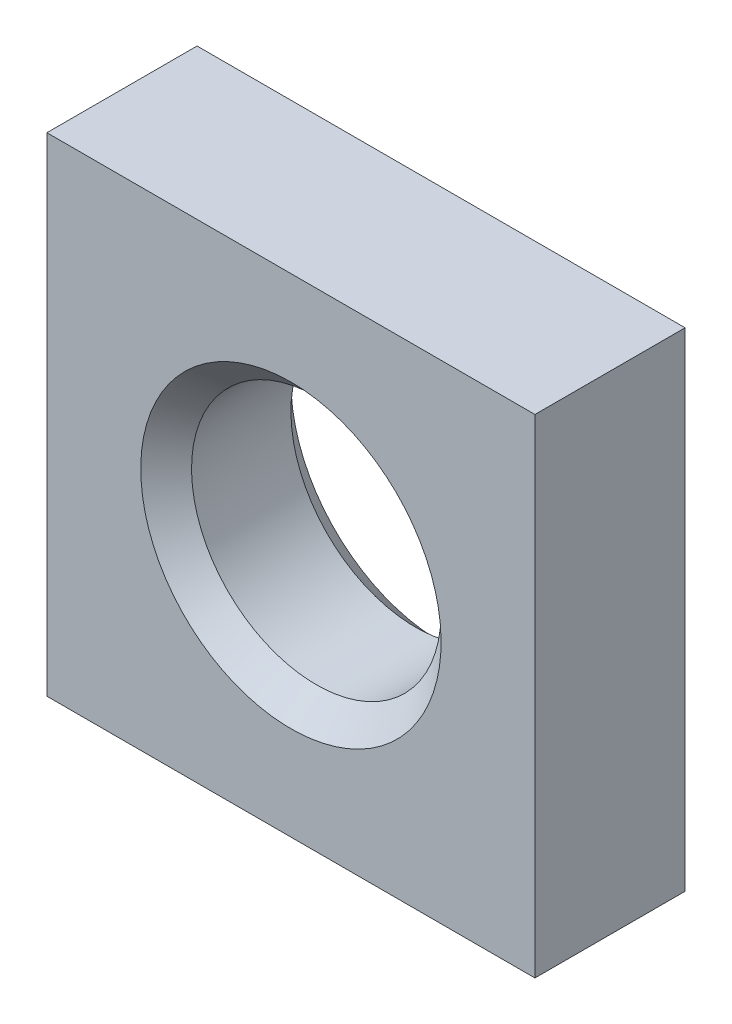
ISO-10303-21;
HEADER;
FILE_DESCRIPTION(('STEP AP214'),'2;1');
FILE_NAME('part.step','',(''),(''),'','','');
FILE_SCHEMA(('AUTOMOTIVE_DESIGN { 1 0 10303 214 1 1 1 1 }'));
ENDSEC;
DATA;
#1=APPLICATION_CONTEXT('core data for automotive mechanical design processes');
#2=APPLICATION_PROTOCOL_DEFINITION('international standard','automotive_design',2000,#1);
#3=PRODUCT_CONTEXT('',#1,'mechanical');
#4=PRODUCT('Part','Part','',(#3));
#5=PRODUCT_RELATED_PRODUCT_CATEGORY('part','',(#4));
#6=PRODUCT_DEFINITION_FORMATION('','',#4);
#7=PRODUCT_DEFINITION_CONTEXT('part definition',#1,'design');
#8=PRODUCT_DEFINITION('design','',#6,#7);
#9=PRODUCT_DEFINITION_SHAPE('','',#8);
#10=(LENGTH_UNIT() NAMED_UNIT(*) SI_UNIT(.MILLI.,.METRE.));
#11=(NAMED_UNIT(*) PLANE_ANGLE_UNIT() SI_UNIT($,.RADIAN.));
#12=(NAMED_UNIT(*) SI_UNIT($,.STERADIAN.) SOLID_ANGLE_UNIT());
#13=UNCERTAINTY_MEASURE_WITH_UNIT(LENGTH_MEASURE(1.E-05),#10,'distance_accuracy_value','');
#14=(GEOMETRIC_REPRESENTATION_CONTEXT(3) GLOBAL_UNCERTAINTY_ASSIGNED_CONTEXT((#13)) GLOBAL_UNIT_ASSIGNED_CONTEXT((#10,
#11,#12)) REPRESENTATION_CONTEXT('',''));
#15=CARTESIAN_POINT('',(0.,0.,0.));
#16=DIRECTION('',(0.,0.,1.));
#17=DIRECTION('',(1.,0.,0.));
#18=AXIS2_PLACEMENT_3D('',#15,#16,#17);
#19=CARTESIAN_POINT('',(0.,-6.49999999999998,2.));
#20=DIRECTION('',(0.,-1.00000000000001,0.));
#21=DIRECTION('',(1.00000000000001,0.,0.));
#22=AXIS2_PLACEMENT_3D('',#19,#20,#21);
#23=PLANE('',#22);
#24=DIRECTION('',(-1.00000000000001,0.,0.));
#25=VECTOR('',#24,1.);
#26=CARTESIAN_POINT('',(0.,-6.49999999999998,0.));
#27=LINE('',#26,#25);
#28=CARTESIAN_POINT('',(6.50000000000001,-6.49999999999992,0.));
#29=VERTEX_POINT('',#28);
#30=CARTESIAN_POINT('',(-6.50000000000005,-6.49999999999998,0.));
#31=VERTEX_POINT('',#30);
#32=EDGE_CURVE('E13',#29,#31,#27,.T.);
#33=ORIENTED_EDGE('',*,*,#32,.F.);
#34=DIRECTION('',(0.,0.,-1.));
#35=VECTOR('',#34,1.);
#36=CARTESIAN_POINT('',(6.5,-6.49999999999992,1.99999999999997));
#37=LINE('',#36,#35);
#38=CARTESIAN_POINT('',(6.5,-6.49999999999992,3.99999999999998));
#39=VERTEX_POINT('',#38);
#40=EDGE_CURVE('E69',#39,#29,#37,.T.);
#41=ORIENTED_EDGE('',*,*,#40,.F.);
#42=DIRECTION('',(1.00000000000001,0.,0.));
#43=VECTOR('',#42,1.);
#44=CARTESIAN_POINT('',(0.,-6.49999999999998,3.99999999999999));
#45=LINE('',#44,#43);
#46=CARTESIAN_POINT('',(-6.50000000000005,-6.49999999999998,3.99999999999995));
#47=VERTEX_POINT('',#46);
#48=EDGE_CURVE('E110',#47,#39,#45,.T.);
#49=ORIENTED_EDGE('',*,*,#48,.F.);
#50=DIRECTION('',(0.,0.,1.));
#51=VECTOR('',#50,1.);
#52=CARTESIAN_POINT('',(-6.50000000000005,-6.49999999999998,1.99999999999995));
#53=LINE('',#52,#51);
#54=EDGE_CURVE('E32',#31,#47,#53,.T.);
#55=ORIENTED_EDGE('',*,*,#54,.F.);
#56=EDGE_LOOP('',(#33,#41,#49,#55));
#57=FACE_BOUND('',#56,.T.);
#58=ADVANCED_FACE('F24',(#57),#23,.T.);
#59=CARTESIAN_POINT('',(0.,6.49999999999987,0.));
#60=DIRECTION('',(0.,0.,-1.));
#61=DIRECTION('',(0.,1.00000000000001,0.));
#62=AXIS2_PLACEMENT_3D('',#59,#60,#61);
#63=PLANE('',#62);
#64=CARTESIAN_POINT('',(0.,0.,0.));
#65=DIRECTION('',(0.,0.,-1.));
#66=DIRECTION('',(0.,1.00000000000001,0.));
#67=AXIS2_PLACEMENT_3D('',#64,#65,#66);
#68=CIRCLE('',#67,4.);
#69=CARTESIAN_POINT('',(0.,4.00000000000002,0.));
#70=VERTEX_POINT('',#69);
#71=EDGE_CURVE('E82',#70,#70,#68,.T.);
#72=ORIENTED_EDGE('',*,*,#71,.F.);
#73=EDGE_LOOP('',(#72));
#74=FACE_BOUND('',#73,.T.);
#75=DIRECTION('',(0.,-1.00000000000001,0.));
#76=VECTOR('',#75,1.);
#77=CARTESIAN_POINT('',(6.50000000000005,6.50000000000006,0.));
#78=LINE('',#77,#76);
#79=CARTESIAN_POINT('',(6.50000000000005,6.50000000000006,0.));
#80=VERTEX_POINT('',#79);
#81=EDGE_CURVE('E62',#80,#29,#78,.T.);
#82=ORIENTED_EDGE('',*,*,#81,.T.);
#83=ORIENTED_EDGE('',*,*,#32,.T.);
#84=DIRECTION('',(0.,-1.00000000000001,0.));
#85=VECTOR('',#84,1.);
#86=CARTESIAN_POINT('',(-6.50000000000002,6.49999999999978,0.));
#87=LINE('',#86,#85);
#88=CARTESIAN_POINT('',(-6.50000000000002,6.49999999999978,0.));
#89=VERTEX_POINT('',#88);
#90=EDGE_CURVE('E76',#89,#31,#87,.T.);
#91=ORIENTED_EDGE('',*,*,#90,.F.);
#92=DIRECTION('',(1.00000000000001,0.,0.));
#93=VECTOR('',#92,1.);
#94=CARTESIAN_POINT('',(0.,6.49999999999987,0.));
#95=LINE('',#94,#93);
#96=EDGE_CURVE('E74',#89,#80,#95,.T.);
#97=ORIENTED_EDGE('',*,*,#96,.T.);
#98=EDGE_LOOP('',(#82,#83,#91,#97));
#99=FACE_BOUND('',#98,.T.);
#100=ADVANCED_FACE('F75',(#74,#99),#63,.T.);
#101=CARTESIAN_POINT('',(-6.50000000000002,6.49999999999978,1.99999999999995));
#102=DIRECTION('',(-1.00000000000001,0.,0.));
#103=DIRECTION('',(0.,-1.00000000000001,0.));
#104=AXIS2_PLACEMENT_3D('',#101,#102,#103);
#105=PLANE('',#104);
#106=ORIENTED_EDGE('',*,*,#90,.T.);
#107=ORIENTED_EDGE('',*,*,#54,.T.);
#108=DIRECTION('',(0.,-1.00000000000001,0.));
#109=VECTOR('',#108,1.);
#110=CARTESIAN_POINT('',(-6.50000000000002,6.49999999999978,3.99999999999995));
#111=LINE('',#110,#109);
#112=CARTESIAN_POINT('',(-6.50000000000002,6.49999999999978,3.99999999999995));
#113=VERTEX_POINT('',#112);
#114=EDGE_CURVE('E102',#113,#47,#111,.T.);
#115=ORIENTED_EDGE('',*,*,#114,.F.);
#116=DIRECTION('',(0.,0.,-1.));
#117=VECTOR('',#116,1.);
#118=CARTESIAN_POINT('',(-6.50000000000002,6.49999999999978,1.99999999999995));
#119=LINE('',#118,#117);
#120=EDGE_CURVE('E81',#113,#89,#119,.T.);
#121=ORIENTED_EDGE('',*,*,#120,.T.);
#122=EDGE_LOOP('',(#106,#107,#115,#121));
#123=FACE_BOUND('',#122,.T.);
#124=ADVANCED_FACE('F122',(#123),#105,.T.);
#125=CARTESIAN_POINT('',(0.,6.4999999999999,3.99999999999999));
#126=DIRECTION('',(0.,0.,1.));
#127=DIRECTION('',(0.,-1.00000000000001,0.));
#128=AXIS2_PLACEMENT_3D('',#125,#126,#127);
#129=PLANE('',#128);
#130=CARTESIAN_POINT('',(0.,0.,3.99999999999999));
#131=DIRECTION('',(0.,0.,-1.));
#132=DIRECTION('',(0.,1.00000000000001,0.));
#133=AXIS2_PLACEMENT_3D('',#130,#131,#132);
#134=CIRCLE('',#133,4.);
#135=CARTESIAN_POINT('',(0.,4.00000000000002,3.99999999999999));
#136=VERTEX_POINT('',#135);
#137=EDGE_CURVE('E154',#136,#136,#134,.T.);
#138=ORIENTED_EDGE('',*,*,#137,.T.);
#139=EDGE_LOOP('',(#138));
#140=FACE_BOUND('',#139,.T.);
#141=ORIENTED_EDGE('',*,*,#114,.T.);
#142=ORIENTED_EDGE('',*,*,#48,.T.);
#143=DIRECTION('',(0.,-1.00000000000001,0.));
#144=VECTOR('',#143,1.);
#145=CARTESIAN_POINT('',(6.50000000000003,6.50000000000009,3.99999999999998));
#146=LINE('',#145,#144);
#147=CARTESIAN_POINT('',(6.50000000000003,6.50000000000009,3.99999999999998));
#148=VERTEX_POINT('',#147);
#149=EDGE_CURVE('E71',#148,#39,#146,.T.);
#150=ORIENTED_EDGE('',*,*,#149,.F.);
#151=DIRECTION('',(-1.00000000000001,0.,0.));
#152=VECTOR('',#151,1.);
#153=CARTESIAN_POINT('',(0.,6.4999999999999,3.99999999999999));
#154=LINE('',#153,#152);
#155=EDGE_CURVE('E87',#148,#113,#154,.T.);
#156=ORIENTED_EDGE('',*,*,#155,.T.);
#157=EDGE_LOOP('',(#141,#142,#150,#156));
#158=FACE_BOUND('',#157,.T.);
#159=ADVANCED_FACE('F138',(#140,#158),#129,.T.);
#160=CARTESIAN_POINT('',(0.,6.4999999999999,2.));
#161=DIRECTION('',(0.,1.00000000000001,0.));
#162=DIRECTION('',(-1.00000000000001,0.,0.));
#163=AXIS2_PLACEMENT_3D('',#160,#161,#162);
#164=PLANE('',#163);
#165=DIRECTION('',(0.,0.,1.));
#166=VECTOR('',#165,1.);
#167=CARTESIAN_POINT('',(6.50000000000003,6.50000000000009,1.99999999999997));
#168=LINE('',#167,#166);
#169=EDGE_CURVE('E67',#80,#148,#168,.T.);
#170=ORIENTED_EDGE('',*,*,#169,.F.);
#171=ORIENTED_EDGE('',*,*,#96,.F.);
#172=ORIENTED_EDGE('',*,*,#120,.F.);
#173=ORIENTED_EDGE('',*,*,#155,.F.);
#174=EDGE_LOOP('',(#170,#171,#172,#173));
#175=FACE_BOUND('',#174,.T.);
#176=ADVANCED_FACE('F85',(#175),#164,.T.);
#177=CARTESIAN_POINT('',(6.50000000000003,6.50000000000009,1.99999999999997));
#178=DIRECTION('',(1.00000000000001,0.,0.));
#179=DIRECTION('',(0.,1.00000000000001,0.));
#180=AXIS2_PLACEMENT_3D('',#177,#178,#179);
#181=PLANE('',#180);
#182=ORIENTED_EDGE('',*,*,#169,.T.);
#183=ORIENTED_EDGE('',*,*,#149,.T.);
#184=ORIENTED_EDGE('',*,*,#40,.T.);
#185=ORIENTED_EDGE('',*,*,#81,.F.);
#186=EDGE_LOOP('',(#182,#183,#184,#185));
#187=FACE_BOUND('',#186,.T.);
#188=ADVANCED_FACE('F64',(#187),#181,.T.);
#189=CARTESIAN_POINT('',(0.,0.,0.));
#190=DIRECTION('',(0.,0.,-1.));
#191=DIRECTION('',(0.,1.00000000000001,0.));
#192=AXIS2_PLACEMENT_3D('',#189,#190,#191);
#193=CONICAL_SURFACE('',#192,4.,0.785398163397449);
#194=CARTESIAN_POINT('',(0.,0.,0.676562499999991));
#195=DIRECTION('',(0.,0.,-1.));
#196=DIRECTION('',(0.,1.00000000000001,0.));
#197=AXIS2_PLACEMENT_3D('',#194,#195,#196);
#198=CIRCLE('',#197,3.3234375);
#199=CARTESIAN_POINT('',(0.,3.32343750000002,0.676562499999991));
#200=VERTEX_POINT('',#199);
#201=EDGE_CURVE('E131',#200,#200,#198,.T.);
#202=ORIENTED_EDGE('',*,*,#201,.F.);
#203=EDGE_LOOP('',(#202));
#204=FACE_BOUND('',#203,.T.);
#205=ORIENTED_EDGE('',*,*,#71,.T.);
#206=EDGE_LOOP('',(#205));
#207=FACE_BOUND('',#206,.T.);
#208=ADVANCED_FACE('F175',(#204,#207),#193,.F.);
#209=CARTESIAN_POINT('',(0.,0.,0.));
#210=DIRECTION('',(0.,0.,-1.));
#211=DIRECTION('',(0.,1.00000000000001,0.));
#212=AXIS2_PLACEMENT_3D('',#209,#210,#211);
#213=CYLINDRICAL_SURFACE('',#212,3.3234375);
#214=CARTESIAN_POINT('',(0.,0.,3.3234375));
#215=DIRECTION('',(0.,0.,-1.));
#216=DIRECTION('',(0.,1.00000000000001,0.));
#217=AXIS2_PLACEMENT_3D('',#214,#215,#216);
#218=CIRCLE('',#217,3.3234375);
#219=CARTESIAN_POINT('',(0.,3.32343750000002,3.3234375));
#220=VERTEX_POINT('',#219);
#221=EDGE_CURVE('E157',#220,#220,#218,.T.);
#222=ORIENTED_EDGE('',*,*,#221,.F.);
#223=EDGE_LOOP('',(#222));
#224=FACE_BOUND('',#223,.T.);
#225=ORIENTED_EDGE('',*,*,#201,.T.);
#226=EDGE_LOOP('',(#225));
#227=FACE_BOUND('',#226,.T.);
#228=ADVANCED_FACE('F184',(#224,#227),#213,.F.);
#229=CARTESIAN_POINT('',(0.,0.,3.3234375));
#230=DIRECTION('',(0.,0.,1.));
#231=DIRECTION('',(0.,-1.00000000000001,0.));
#232=AXIS2_PLACEMENT_3D('',#229,#230,#231);
#233=CONICAL_SURFACE('',#232,3.3234375,0.785398163397448);
#234=ORIENTED_EDGE('',*,*,#137,.F.);
#235=EDGE_LOOP('',(#234));
#236=FACE_BOUND('',#235,.T.);
#237=ORIENTED_EDGE('',*,*,#221,.T.);
#238=EDGE_LOOP('',(#237));
#239=FACE_BOUND('',#238,.T.);
#240=ADVANCED_FACE('F195',(#236,#239),#233,.F.);
#241=CLOSED_SHELL('',(#58,#100,#124,#159,#176,#188,#208,#228,#240));
#242=MANIFOLD_SOLID_BREP('B1',#241);
#243=ADVANCED_BREP_SHAPE_REPRESENTATION('',(#18,#242),#14);
#244=SHAPE_DEFINITION_REPRESENTATION(#9,#243);
ENDSEC;
END-ISO-10303-21;
